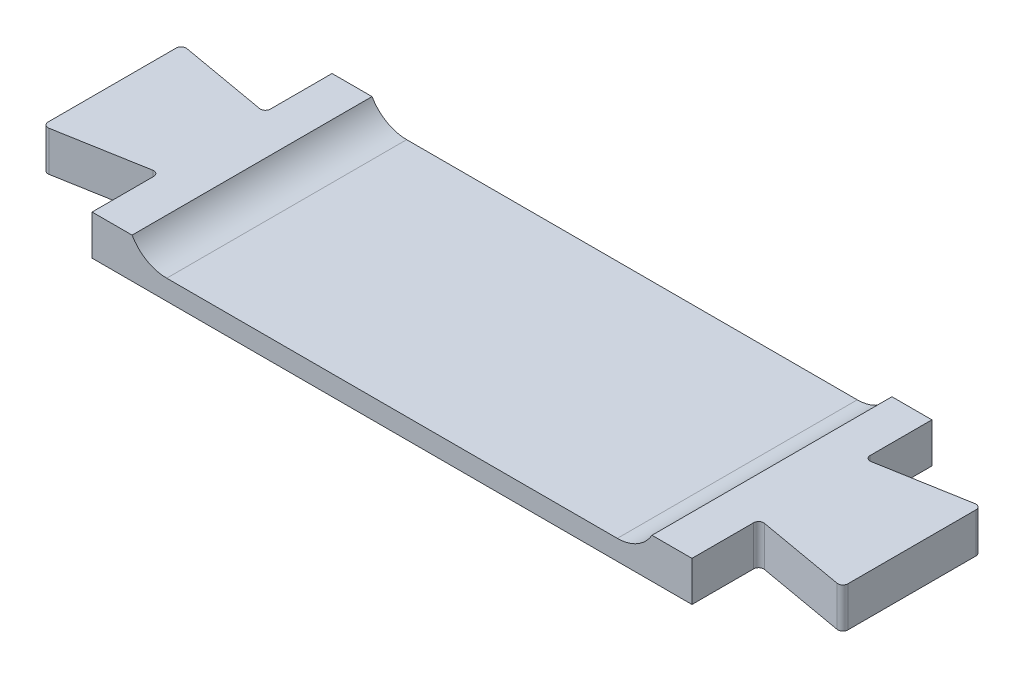
ISO-10303-21;
HEADER;
FILE_DESCRIPTION(('STEP AP214'),'2;1');
FILE_NAME('part.step','',(''),(''),'','','');
FILE_SCHEMA(('AUTOMOTIVE_DESIGN { 1 0 10303 214 1 1 1 1 }'));
ENDSEC;
DATA;
#1=APPLICATION_CONTEXT('core data for automotive mechanical design processes');
#2=APPLICATION_PROTOCOL_DEFINITION('international standard','automotive_design',2000,#1);
#3=PRODUCT_CONTEXT('',#1,'mechanical');
#4=PRODUCT('Part','Part','',(#3));
#5=PRODUCT_RELATED_PRODUCT_CATEGORY('part','',(#4));
#6=PRODUCT_DEFINITION_FORMATION('','',#4);
#7=PRODUCT_DEFINITION_CONTEXT('part definition',#1,'design');
#8=PRODUCT_DEFINITION('design','',#6,#7);
#9=PRODUCT_DEFINITION_SHAPE('','',#8);
#10=(LENGTH_UNIT() NAMED_UNIT(*) SI_UNIT(.MILLI.,.METRE.));
#11=(NAMED_UNIT(*) PLANE_ANGLE_UNIT() SI_UNIT($,.RADIAN.));
#12=(NAMED_UNIT(*) SI_UNIT($,.STERADIAN.) SOLID_ANGLE_UNIT());
#13=UNCERTAINTY_MEASURE_WITH_UNIT(LENGTH_MEASURE(1.E-05),#10,'distance_accuracy_value','');
#14=(GEOMETRIC_REPRESENTATION_CONTEXT(3) GLOBAL_UNCERTAINTY_ASSIGNED_CONTEXT((#13)) GLOBAL_UNIT_ASSIGNED_CONTEXT((#10,
#11,#12)) REPRESENTATION_CONTEXT('',''));
#15=CARTESIAN_POINT('',(0.,0.,0.));
#16=DIRECTION('',(0.,0.,1.));
#17=DIRECTION('',(1.,0.,0.));
#18=AXIS2_PLACEMENT_3D('',#15,#16,#17);
#19=CARTESIAN_POINT('',(0.,2.,0.));
#20=DIRECTION('',(0.,-1.,0.));
#21=DIRECTION('',(0.,0.,-1.));
#22=AXIS2_PLACEMENT_3D('',#19,#20,#21);
#23=PLANE('',#22);
#24=DIRECTION('',(1.,0.,0.));
#25=VECTOR('',#24,1.);
#26=CARTESIAN_POINT('',(-15.,2.,6.));
#27=LINE('',#26,#25);
#28=CARTESIAN_POINT('',(-15.,2.,6.));
#29=VERTEX_POINT('',#28);
#30=CARTESIAN_POINT('',(-13.,2.,6.));
#31=VERTEX_POINT('',#30);
#32=EDGE_CURVE('E216',#29,#31,#27,.T.);
#33=ORIENTED_EDGE('',*,*,#32,.T.);
#34=DIRECTION('',(0.,0.,1.));
#35=VECTOR('',#34,1.);
#36=CARTESIAN_POINT('',(-13.,2.,-6.));
#37=LINE('',#36,#35);
#38=CARTESIAN_POINT('',(-13.,2.,-6.));
#39=VERTEX_POINT('',#38);
#40=EDGE_CURVE('E226',#39,#31,#37,.T.);
#41=ORIENTED_EDGE('',*,*,#40,.F.);
#42=DIRECTION('',(-1.,0.,0.));
#43=VECTOR('',#42,1.);
#44=CARTESIAN_POINT('',(-15.,2.,-6.));
#45=LINE('',#44,#43);
#46=CARTESIAN_POINT('',(-15.,2.,-6.));
#47=VERTEX_POINT('',#46);
#48=EDGE_CURVE('E245',#39,#47,#45,.T.);
#49=ORIENTED_EDGE('',*,*,#48,.T.);
#50=DIRECTION('',(0.,0.,1.));
#51=VECTOR('',#50,1.);
#52=CARTESIAN_POINT('',(-15.,2.,-2.61836509645765));
#53=LINE('',#52,#51);
#54=CARTESIAN_POINT('',(-15.,2.,-2.91630349460621));
#55=VERTEX_POINT('',#54);
#56=EDGE_CURVE('E251',#47,#55,#53,.T.);
#57=ORIENTED_EDGE('',*,*,#56,.T.);
#58=CARTESIAN_POINT('',(-15.25,2.,-2.91630349460621));
#59=DIRECTION('',(0.,-1.,0.));
#60=DIRECTION('',(0.,0.,-1.));
#61=AXIS2_PLACEMENT_3D('',#58,#59,#60);
#62=CIRCLE('',#61,0.25);
#63=CARTESIAN_POINT('',(-15.2934120444167,2.,-2.67010155635316));
#64=VERTEX_POINT('',#63);
#65=EDGE_CURVE('E395',#55,#64,#62,.T.);
#66=ORIENTED_EDGE('',*,*,#65,.T.);
#67=DIRECTION('',(-0.984807753012207,0.,-0.173648177666934));
#68=VECTOR('',#67,1.);
#69=CARTESIAN_POINT('',(-15.,2.,-2.61836509645765));
#70=LINE('',#69,#68);
#71=CARTESIAN_POINT('',(-19.7065879555833,2.,-3.4482635401045));
#72=VERTEX_POINT('',#71);
#73=EDGE_CURVE('E254',#64,#72,#70,.T.);
#74=ORIENTED_EDGE('',*,*,#73,.T.);
#75=CARTESIAN_POINT('',(-19.75,2.,-3.20206160185145));
#76=DIRECTION('',(0.,-1.,0.));
#77=DIRECTION('',(0.,0.,-1.));
#78=AXIS2_PLACEMENT_3D('',#75,#76,#77);
#79=CIRCLE('',#78,0.25);
#80=CARTESIAN_POINT('',(-20.,2.,-3.20206160185145));
#81=VERTEX_POINT('',#80);
#82=EDGE_CURVE('E354',#72,#81,#79,.F.);
#83=ORIENTED_EDGE('',*,*,#82,.T.);
#84=DIRECTION('',(0.,0.,1.));
#85=VECTOR('',#84,1.);
#86=CARTESIAN_POINT('',(-20.,2.,-3.5));
#87=LINE('',#86,#85);
#88=CARTESIAN_POINT('',(-20.,2.,3.20206160185145));
#89=VERTEX_POINT('',#88);
#90=EDGE_CURVE('E257',#81,#89,#87,.T.);
#91=ORIENTED_EDGE('',*,*,#90,.T.);
#92=CARTESIAN_POINT('',(-19.75,2.,3.20206160185145));
#93=DIRECTION('',(0.,-1.,0.));
#94=DIRECTION('',(0.,0.,-1.));
#95=AXIS2_PLACEMENT_3D('',#92,#93,#94);
#96=CIRCLE('',#95,0.25);
#97=CARTESIAN_POINT('',(-19.7065879555833,2.,3.4482635401045));
#98=VERTEX_POINT('',#97);
#99=EDGE_CURVE('E356',#89,#98,#96,.F.);
#100=ORIENTED_EDGE('',*,*,#99,.T.);
#101=DIRECTION('',(0.984807753012207,0.,-0.173648177666935));
#102=VECTOR('',#101,1.);
#103=CARTESIAN_POINT('',(-15.,2.,2.61836509645765));
#104=LINE('',#103,#102);
#105=CARTESIAN_POINT('',(-15.2934120444167,2.,2.67010155635316));
#106=VERTEX_POINT('',#105);
#107=EDGE_CURVE('E260',#98,#106,#104,.T.);
#108=ORIENTED_EDGE('',*,*,#107,.T.);
#109=CARTESIAN_POINT('',(-15.25,2.,2.91630349460621));
#110=DIRECTION('',(0.,-1.,0.));
#111=DIRECTION('',(0.,0.,-1.));
#112=AXIS2_PLACEMENT_3D('',#109,#110,#111);
#113=CIRCLE('',#112,0.25);
#114=CARTESIAN_POINT('',(-15.,2.,2.91630349460621));
#115=VERTEX_POINT('',#114);
#116=EDGE_CURVE('E391',#106,#115,#113,.T.);
#117=ORIENTED_EDGE('',*,*,#116,.T.);
#118=DIRECTION('',(0.,0.,1.));
#119=VECTOR('',#118,1.);
#120=CARTESIAN_POINT('',(-15.,2.,6.));
#121=LINE('',#120,#119);
#122=EDGE_CURVE('E228',#115,#29,#121,.T.);
#123=ORIENTED_EDGE('',*,*,#122,.T.);
#124=EDGE_LOOP('',(#33,#41,#49,#57,#66,#74,#83,#91,#100,#108,#117,#123));
#125=FACE_BOUND('',#124,.T.);
#126=ADVANCED_FACE('F40',(#125),#23,.F.);
#127=CARTESIAN_POINT('',(15.,2.,-2.61836509645766));
#128=DIRECTION('',(-1.,0.,0.));
#129=DIRECTION('',(0.,0.,1.));
#130=AXIS2_PLACEMENT_3D('',#127,#128,#129);
#131=PLANE('',#130);
#132=DIRECTION('',(0.,0.,-1.));
#133=VECTOR('',#132,1.);
#134=CARTESIAN_POINT('',(15.,2.,-2.61836509645766));
#135=LINE('',#134,#133);
#136=CARTESIAN_POINT('',(15.,2.,-2.91630349460621));
#137=VERTEX_POINT('',#136);
#138=CARTESIAN_POINT('',(15.,2.,-6.));
#139=VERTEX_POINT('',#138);
#140=EDGE_CURVE('E242',#137,#139,#135,.T.);
#141=ORIENTED_EDGE('',*,*,#140,.F.);
#142=DIRECTION('',(0.,-1.,0.));
#143=VECTOR('',#142,1.);
#144=CARTESIAN_POINT('',(15.,0.,-2.91630349460621));
#145=LINE('',#144,#143);
#146=CARTESIAN_POINT('',(15.,0.,-2.91630349460621));
#147=VERTEX_POINT('',#146);
#148=EDGE_CURVE('E365',#137,#147,#145,.T.);
#149=ORIENTED_EDGE('',*,*,#148,.T.);
#150=DIRECTION('',(0.,0.,-1.));
#151=VECTOR('',#150,1.);
#152=CARTESIAN_POINT('',(15.,0.,-2.61836509645766));
#153=LINE('',#152,#151);
#154=CARTESIAN_POINT('',(15.,0.,-6.));
#155=VERTEX_POINT('',#154);
#156=EDGE_CURVE('E280',#147,#155,#153,.T.);
#157=ORIENTED_EDGE('',*,*,#156,.T.);
#158=DIRECTION('',(0.,-1.,0.));
#159=VECTOR('',#158,1.);
#160=CARTESIAN_POINT('',(15.,2.,-6.));
#161=LINE('',#160,#159);
#162=EDGE_CURVE('E324',#139,#155,#161,.T.);
#163=ORIENTED_EDGE('',*,*,#162,.F.);
#164=EDGE_LOOP('',(#141,#149,#157,#163));
#165=FACE_BOUND('',#164,.T.);
#166=ADVANCED_FACE('F461',(#165),#131,.F.);
#167=CARTESIAN_POINT('',(-15.,2.,-6.));
#168=DIRECTION('',(0.,0.,1.));
#169=DIRECTION('',(1.,0.,0.));
#170=AXIS2_PLACEMENT_3D('',#167,#168,#169);
#171=PLANE('',#170);
#172=ORIENTED_EDGE('',*,*,#48,.F.);
#173=CARTESIAN_POINT('',(-11.2679491924311,3.,-6.));
#174=DIRECTION('',(0.,0.,1.));
#175=DIRECTION('',(1.,0.,0.));
#176=AXIS2_PLACEMENT_3D('',#173,#174,#175);
#177=CIRCLE('',#176,2.);
#178=CARTESIAN_POINT('',(-11.2679491924311,1.,-6.));
#179=VERTEX_POINT('',#178);
#180=EDGE_CURVE('E56',#39,#179,#177,.T.);
#181=ORIENTED_EDGE('',*,*,#180,.T.);
#182=DIRECTION('',(-1.,0.,0.));
#183=VECTOR('',#182,1.);
#184=CARTESIAN_POINT('',(-13.,1.,-6.));
#185=LINE('',#184,#183);
#186=CARTESIAN_POINT('',(11.2679491924311,1.,-6.));
#187=VERTEX_POINT('',#186);
#188=EDGE_CURVE('E239',#187,#179,#185,.T.);
#189=ORIENTED_EDGE('',*,*,#188,.F.);
#190=CARTESIAN_POINT('',(11.2679491924311,3.,-6.));
#191=DIRECTION('',(0.,0.,1.));
#192=DIRECTION('',(1.,0.,0.));
#193=AXIS2_PLACEMENT_3D('',#190,#191,#192);
#194=CIRCLE('',#193,2.);
#195=CARTESIAN_POINT('',(13.,2.,-6.));
#196=VERTEX_POINT('',#195);
#197=EDGE_CURVE('E49',#187,#196,#194,.T.);
#198=ORIENTED_EDGE('',*,*,#197,.T.);
#199=EDGE_CURVE('E247',#139,#196,#45,.T.);
#200=ORIENTED_EDGE('',*,*,#199,.F.);
#201=ORIENTED_EDGE('',*,*,#162,.T.);
#202=DIRECTION('',(-1.,0.,0.));
#203=VECTOR('',#202,1.);
#204=CARTESIAN_POINT('',(-15.,0.,-6.));
#205=LINE('',#204,#203);
#206=CARTESIAN_POINT('',(-15.,0.,-6.));
#207=VERTEX_POINT('',#206);
#208=EDGE_CURVE('E282',#155,#207,#205,.T.);
#209=ORIENTED_EDGE('',*,*,#208,.T.);
#210=DIRECTION('',(0.,-1.,0.));
#211=VECTOR('',#210,1.);
#212=CARTESIAN_POINT('',(-15.,2.,-6.));
#213=LINE('',#212,#211);
#214=EDGE_CURVE('E321',#47,#207,#213,.T.);
#215=ORIENTED_EDGE('',*,*,#214,.F.);
#216=EDGE_LOOP('',(#172,#181,#189,#198,#200,#201,#209,#215));
#217=FACE_BOUND('',#216,.T.);
#218=ADVANCED_FACE('F411',(#217),#171,.F.);
#219=CARTESIAN_POINT('',(-15.,2.,-2.61836509645765));
#220=DIRECTION('',(1.,0.,0.));
#221=DIRECTION('',(0.,0.,-1.));
#222=AXIS2_PLACEMENT_3D('',#219,#220,#221);
#223=PLANE('',#222);
#224=DIRECTION('',(0.,0.,1.));
#225=VECTOR('',#224,1.);
#226=CARTESIAN_POINT('',(-15.,0.,-2.61836509645765));
#227=LINE('',#226,#225);
#228=CARTESIAN_POINT('',(-15.,0.,-2.91630349460621));
#229=VERTEX_POINT('',#228);
#230=EDGE_CURVE('E284',#207,#229,#227,.T.);
#231=ORIENTED_EDGE('',*,*,#230,.T.);
#232=DIRECTION('',(0.,-1.,0.));
#233=VECTOR('',#232,1.);
#234=CARTESIAN_POINT('',(-15.,2.,-2.91630349460621));
#235=LINE('',#234,#233);
#236=EDGE_CURVE('E363',#229,#55,#235,.F.);
#237=ORIENTED_EDGE('',*,*,#236,.T.);
#238=ORIENTED_EDGE('',*,*,#56,.F.);
#239=ORIENTED_EDGE('',*,*,#214,.T.);
#240=EDGE_LOOP('',(#231,#237,#238,#239));
#241=FACE_BOUND('',#240,.T.);
#242=ADVANCED_FACE('F469',(#241),#223,.F.);
#243=CARTESIAN_POINT('',(-15.,2.,-2.61836509645765));
#244=DIRECTION('',(-0.173648177666934,0.,0.984807753012207));
#245=DIRECTION('',(0.984807753012208,0.,0.173648177666934));
#246=AXIS2_PLACEMENT_3D('',#243,#244,#245);
#247=PLANE('',#246);
#248=DIRECTION('',(-0.984807753012207,0.,-0.173648177666934));
#249=VECTOR('',#248,1.);
#250=CARTESIAN_POINT('',(-15.,0.,-2.61836509645765));
#251=LINE('',#250,#249);
#252=CARTESIAN_POINT('',(-15.2934120444167,0.,-2.67010155635316));
#253=VERTEX_POINT('',#252);
#254=CARTESIAN_POINT('',(-19.7065879555833,0.,-3.4482635401045));
#255=VERTEX_POINT('',#254);
#256=EDGE_CURVE('E287',#253,#255,#251,.T.);
#257=ORIENTED_EDGE('',*,*,#256,.T.);
#258=DIRECTION('',(0.,-1.,0.));
#259=VECTOR('',#258,1.);
#260=CARTESIAN_POINT('',(-19.7065879555833,2.,-3.4482635401045));
#261=LINE('',#260,#259);
#262=EDGE_CURVE('E361',#255,#72,#261,.F.);
#263=ORIENTED_EDGE('',*,*,#262,.T.);
#264=ORIENTED_EDGE('',*,*,#73,.F.);
#265=DIRECTION('',(0.,-1.,0.));
#266=VECTOR('',#265,1.);
#267=CARTESIAN_POINT('',(-15.2934120444167,0.,-2.67010155635316));
#268=LINE('',#267,#266);
#269=EDGE_CURVE('E358',#64,#253,#268,.T.);
#270=ORIENTED_EDGE('',*,*,#269,.T.);
#271=EDGE_LOOP('',(#257,#263,#264,#270));
#272=FACE_BOUND('',#271,.T.);
#273=ADVANCED_FACE('F480',(#272),#247,.F.);
#274=CARTESIAN_POINT('',(-20.,2.,-3.5));
#275=DIRECTION('',(1.,0.,0.));
#276=DIRECTION('',(0.,0.,-1.));
#277=AXIS2_PLACEMENT_3D('',#274,#275,#276);
#278=PLANE('',#277);
#279=DIRECTION('',(0.,0.,1.));
#280=VECTOR('',#279,1.);
#281=CARTESIAN_POINT('',(-20.,0.,-3.5));
#282=LINE('',#281,#280);
#283=CARTESIAN_POINT('',(-20.,0.,-3.20206160185145));
#284=VERTEX_POINT('',#283);
#285=CARTESIAN_POINT('',(-20.,0.,3.20206160185145));
#286=VERTEX_POINT('',#285);
#287=EDGE_CURVE('E290',#284,#286,#282,.T.);
#288=ORIENTED_EDGE('',*,*,#287,.T.);
#289=DIRECTION('',(0.,-1.,0.));
#290=VECTOR('',#289,1.);
#291=CARTESIAN_POINT('',(-20.,2.,3.20206160185145));
#292=LINE('',#291,#290);
#293=EDGE_CURVE('E348',#286,#89,#292,.F.);
#294=ORIENTED_EDGE('',*,*,#293,.T.);
#295=ORIENTED_EDGE('',*,*,#90,.F.);
#296=DIRECTION('',(0.,-1.,0.));
#297=VECTOR('',#296,1.);
#298=CARTESIAN_POINT('',(-20.,2.,-3.20206160185145));
#299=LINE('',#298,#297);
#300=EDGE_CURVE('E345',#81,#284,#299,.T.);
#301=ORIENTED_EDGE('',*,*,#300,.T.);
#302=EDGE_LOOP('',(#288,#294,#295,#301));
#303=FACE_BOUND('',#302,.T.);
#304=ADVANCED_FACE('F489',(#303),#278,.F.);
#305=CARTESIAN_POINT('',(-15.,2.,2.61836509645765));
#306=DIRECTION('',(-0.173648177666935,0.,-0.984807753012207));
#307=DIRECTION('',(-0.984807753012207,0.,0.173648177666935));
#308=AXIS2_PLACEMENT_3D('',#305,#306,#307);
#309=PLANE('',#308);
#310=DIRECTION('',(0.984807753012207,0.,-0.173648177666935));
#311=VECTOR('',#310,1.);
#312=CARTESIAN_POINT('',(-15.,0.,2.61836509645765));
#313=LINE('',#312,#311);
#314=CARTESIAN_POINT('',(-19.7065879555833,0.,3.4482635401045));
#315=VERTEX_POINT('',#314);
#316=CARTESIAN_POINT('',(-15.2934120444167,0.,2.67010155635316));
#317=VERTEX_POINT('',#316);
#318=EDGE_CURVE('E293',#315,#317,#313,.T.);
#319=ORIENTED_EDGE('',*,*,#318,.T.);
#320=DIRECTION('',(0.,-1.,0.));
#321=VECTOR('',#320,1.);
#322=CARTESIAN_POINT('',(-15.2934120444167,2.,2.67010155635316));
#323=LINE('',#322,#321);
#324=EDGE_CURVE('E334',#317,#106,#323,.F.);
#325=ORIENTED_EDGE('',*,*,#324,.T.);
#326=ORIENTED_EDGE('',*,*,#107,.F.);
#327=DIRECTION('',(0.,-1.,0.));
#328=VECTOR('',#327,1.);
#329=CARTESIAN_POINT('',(-19.7065879555833,2.,3.4482635401045));
#330=LINE('',#329,#328);
#331=EDGE_CURVE('E331',#98,#315,#330,.T.);
#332=ORIENTED_EDGE('',*,*,#331,.T.);
#333=EDGE_LOOP('',(#319,#325,#326,#332));
#334=FACE_BOUND('',#333,.T.);
#335=ADVANCED_FACE('F497',(#334),#309,.F.);
#336=CARTESIAN_POINT('',(-15.,2.,6.));
#337=DIRECTION('',(1.,0.,0.));
#338=DIRECTION('',(0.,0.,-1.));
#339=AXIS2_PLACEMENT_3D('',#336,#337,#338);
#340=PLANE('',#339);
#341=ORIENTED_EDGE('',*,*,#122,.F.);
#342=DIRECTION('',(0.,-1.,0.));
#343=VECTOR('',#342,1.);
#344=CARTESIAN_POINT('',(-15.,0.,2.91630349460621));
#345=LINE('',#344,#343);
#346=CARTESIAN_POINT('',(-15.,0.,2.91630349460621));
#347=VERTEX_POINT('',#346);
#348=EDGE_CURVE('E328',#115,#347,#345,.T.);
#349=ORIENTED_EDGE('',*,*,#348,.T.);
#350=DIRECTION('',(0.,0.,1.));
#351=VECTOR('',#350,1.);
#352=CARTESIAN_POINT('',(-15.,0.,6.));
#353=LINE('',#352,#351);
#354=CARTESIAN_POINT('',(-15.,0.,6.));
#355=VERTEX_POINT('',#354);
#356=EDGE_CURVE('E296',#347,#355,#353,.T.);
#357=ORIENTED_EDGE('',*,*,#356,.T.);
#358=DIRECTION('',(0.,-1.,0.));
#359=VECTOR('',#358,1.);
#360=CARTESIAN_POINT('',(-15.,2.,6.));
#361=LINE('',#360,#359);
#362=EDGE_CURVE('E319',#29,#355,#361,.T.);
#363=ORIENTED_EDGE('',*,*,#362,.F.);
#364=EDGE_LOOP('',(#341,#349,#357,#363));
#365=FACE_BOUND('',#364,.T.);
#366=ADVANCED_FACE('F505',(#365),#340,.F.);
#367=CARTESIAN_POINT('',(-15.,2.,6.));
#368=DIRECTION('',(0.,0.,-1.));
#369=DIRECTION('',(-1.,0.,0.));
#370=AXIS2_PLACEMENT_3D('',#367,#368,#369);
#371=PLANE('',#370);
#372=DIRECTION('',(1.,0.,0.));
#373=VECTOR('',#372,1.);
#374=CARTESIAN_POINT('',(-13.,1.,6.));
#375=LINE('',#374,#373);
#376=CARTESIAN_POINT('',(-11.2679491924311,1.,6.));
#377=VERTEX_POINT('',#376);
#378=CARTESIAN_POINT('',(11.2679491924311,1.,6.));
#379=VERTEX_POINT('',#378);
#380=EDGE_CURVE('E218',#377,#379,#375,.T.);
#381=ORIENTED_EDGE('',*,*,#380,.F.);
#382=CARTESIAN_POINT('',(-11.2679491924311,3.,6.));
#383=DIRECTION('',(0.,0.,-1.));
#384=DIRECTION('',(-1.,0.,0.));
#385=AXIS2_PLACEMENT_3D('',#382,#383,#384);
#386=CIRCLE('',#385,2.);
#387=EDGE_CURVE('E212',#377,#31,#386,.T.);
#388=ORIENTED_EDGE('',*,*,#387,.T.);
#389=ORIENTED_EDGE('',*,*,#32,.F.);
#390=ORIENTED_EDGE('',*,*,#362,.T.);
#391=DIRECTION('',(1.,0.,0.));
#392=VECTOR('',#391,1.);
#393=CARTESIAN_POINT('',(-15.,0.,6.));
#394=LINE('',#393,#392);
#395=CARTESIAN_POINT('',(15.,0.,6.));
#396=VERTEX_POINT('',#395);
#397=EDGE_CURVE('E298',#355,#396,#394,.T.);
#398=ORIENTED_EDGE('',*,*,#397,.T.);
#399=DIRECTION('',(0.,-1.,0.));
#400=VECTOR('',#399,1.);
#401=CARTESIAN_POINT('',(15.,2.,6.));
#402=LINE('',#401,#400);
#403=CARTESIAN_POINT('',(15.,2.,6.));
#404=VERTEX_POINT('',#403);
#405=EDGE_CURVE('E279',#404,#396,#402,.T.);
#406=ORIENTED_EDGE('',*,*,#405,.F.);
#407=CARTESIAN_POINT('',(13.,2.,6.));
#408=VERTEX_POINT('',#407);
#409=EDGE_CURVE('E231',#408,#404,#27,.T.);
#410=ORIENTED_EDGE('',*,*,#409,.F.);
#411=CARTESIAN_POINT('',(11.2679491924311,3.,6.));
#412=DIRECTION('',(0.,0.,-1.));
#413=DIRECTION('',(-1.,0.,0.));
#414=AXIS2_PLACEMENT_3D('',#411,#412,#413);
#415=CIRCLE('',#414,2.);
#416=EDGE_CURVE('E11',#408,#379,#415,.T.);
#417=ORIENTED_EDGE('',*,*,#416,.T.);
#418=EDGE_LOOP('',(#381,#388,#389,#390,#398,#406,#410,#417));
#419=FACE_BOUND('',#418,.T.);
#420=ADVANCED_FACE('F214',(#419),#371,.F.);
#421=CARTESIAN_POINT('',(15.,2.,6.));
#422=DIRECTION('',(-1.,0.,0.));
#423=DIRECTION('',(0.,0.,1.));
#424=AXIS2_PLACEMENT_3D('',#421,#422,#423);
#425=PLANE('',#424);
#426=DIRECTION('',(0.,0.,-1.));
#427=VECTOR('',#426,1.);
#428=CARTESIAN_POINT('',(15.,0.,6.));
#429=LINE('',#428,#427);
#430=CARTESIAN_POINT('',(15.,0.,2.91630349460621));
#431=VERTEX_POINT('',#430);
#432=EDGE_CURVE('E301',#396,#431,#429,.T.);
#433=ORIENTED_EDGE('',*,*,#432,.T.);
#434=DIRECTION('',(0.,-1.,0.));
#435=VECTOR('',#434,1.);
#436=CARTESIAN_POINT('',(15.,2.,2.91630349460621));
#437=LINE('',#436,#435);
#438=CARTESIAN_POINT('',(15.,2.,2.91630349460621));
#439=VERTEX_POINT('',#438);
#440=EDGE_CURVE('E386',#431,#439,#437,.F.);
#441=ORIENTED_EDGE('',*,*,#440,.T.);
#442=DIRECTION('',(0.,0.,-1.));
#443=VECTOR('',#442,1.);
#444=CARTESIAN_POINT('',(15.,2.,6.));
#445=LINE('',#444,#443);
#446=EDGE_CURVE('E230',#404,#439,#445,.T.);
#447=ORIENTED_EDGE('',*,*,#446,.F.);
#448=ORIENTED_EDGE('',*,*,#405,.T.);
#449=EDGE_LOOP('',(#433,#441,#447,#448));
#450=FACE_BOUND('',#449,.T.);
#451=ADVANCED_FACE('F428',(#450),#425,.F.);
#452=CARTESIAN_POINT('',(15.,2.,2.61836509645765));
#453=DIRECTION('',(0.173648177666935,0.,-0.984807753012207));
#454=DIRECTION('',(-0.984807753012207,0.,-0.173648177666935));
#455=AXIS2_PLACEMENT_3D('',#452,#453,#454);
#456=PLANE('',#455);
#457=DIRECTION('',(0.984807753012207,0.,0.173648177666935));
#458=VECTOR('',#457,1.);
#459=CARTESIAN_POINT('',(15.,0.,2.61836509645765));
#460=LINE('',#459,#458);
#461=CARTESIAN_POINT('',(15.2934120444167,0.,2.67010155635316));
#462=VERTEX_POINT('',#461);
#463=CARTESIAN_POINT('',(19.7065879555833,0.,3.4482635401045));
#464=VERTEX_POINT('',#463);
#465=EDGE_CURVE('E305',#462,#464,#460,.T.);
#466=ORIENTED_EDGE('',*,*,#465,.T.);
#467=DIRECTION('',(0.,-1.,0.));
#468=VECTOR('',#467,1.);
#469=CARTESIAN_POINT('',(19.7065879555833,2.,3.4482635401045));
#470=LINE('',#469,#468);
#471=CARTESIAN_POINT('',(19.7065879555833,2.,3.4482635401045));
#472=VERTEX_POINT('',#471);
#473=EDGE_CURVE('E383',#464,#472,#470,.F.);
#474=ORIENTED_EDGE('',*,*,#473,.T.);
#475=DIRECTION('',(0.984807753012207,0.,0.173648177666935));
#476=VECTOR('',#475,1.);
#477=CARTESIAN_POINT('',(15.,2.,2.61836509645765));
#478=LINE('',#477,#476);
#479=CARTESIAN_POINT('',(15.2934120444167,2.,2.67010155635316));
#480=VERTEX_POINT('',#479);
#481=EDGE_CURVE('E267',#480,#472,#478,.T.);
#482=ORIENTED_EDGE('',*,*,#481,.F.);
#483=DIRECTION('',(0.,-1.,0.));
#484=VECTOR('',#483,1.);
#485=CARTESIAN_POINT('',(15.2934120444167,0.,2.67010155635316));
#486=LINE('',#485,#484);
#487=EDGE_CURVE('E379',#480,#462,#486,.T.);
#488=ORIENTED_EDGE('',*,*,#487,.T.);
#489=EDGE_LOOP('',(#466,#474,#482,#488));
#490=FACE_BOUND('',#489,.T.);
#491=ADVANCED_FACE('F436',(#490),#456,.F.);
#492=CARTESIAN_POINT('',(20.,2.,-3.50000000000001));
#493=DIRECTION('',(-1.,0.,0.));
#494=DIRECTION('',(0.,0.,1.));
#495=AXIS2_PLACEMENT_3D('',#492,#493,#494);
#496=PLANE('',#495);
#497=DIRECTION('',(0.,0.,-1.));
#498=VECTOR('',#497,1.);
#499=CARTESIAN_POINT('',(20.,0.,-3.50000000000001));
#500=LINE('',#499,#498);
#501=CARTESIAN_POINT('',(20.,0.,3.20206160185145));
#502=VERTEX_POINT('',#501);
#503=CARTESIAN_POINT('',(20.,0.,-3.20206160185145));
#504=VERTEX_POINT('',#503);
#505=EDGE_CURVE('E309',#502,#504,#500,.T.);
#506=ORIENTED_EDGE('',*,*,#505,.T.);
#507=DIRECTION('',(0.,-1.,0.));
#508=VECTOR('',#507,1.);
#509=CARTESIAN_POINT('',(20.,2.,-3.20206160185145));
#510=LINE('',#509,#508);
#511=CARTESIAN_POINT('',(20.,2.,-3.20206160185145));
#512=VERTEX_POINT('',#511);
#513=EDGE_CURVE('E377',#504,#512,#510,.F.);
#514=ORIENTED_EDGE('',*,*,#513,.T.);
#515=DIRECTION('',(0.,0.,-1.));
#516=VECTOR('',#515,1.);
#517=CARTESIAN_POINT('',(20.,2.,-3.50000000000001));
#518=LINE('',#517,#516);
#519=CARTESIAN_POINT('',(20.,2.,3.20206160185145));
#520=VERTEX_POINT('',#519);
#521=EDGE_CURVE('E271',#520,#512,#518,.T.);
#522=ORIENTED_EDGE('',*,*,#521,.F.);
#523=DIRECTION('',(0.,-1.,0.));
#524=VECTOR('',#523,1.);
#525=CARTESIAN_POINT('',(20.,2.,3.20206160185145));
#526=LINE('',#525,#524);
#527=EDGE_CURVE('E373',#520,#502,#526,.T.);
#528=ORIENTED_EDGE('',*,*,#527,.T.);
#529=EDGE_LOOP('',(#506,#514,#522,#528));
#530=FACE_BOUND('',#529,.T.);
#531=ADVANCED_FACE('F445',(#530),#496,.F.);
#532=CARTESIAN_POINT('',(15.,2.,-2.61836509645766));
#533=DIRECTION('',(0.173648177666935,0.,0.984807753012207));
#534=DIRECTION('',(0.984807753012207,0.,-0.173648177666935));
#535=AXIS2_PLACEMENT_3D('',#532,#533,#534);
#536=PLANE('',#535);
#537=DIRECTION('',(-0.984807753012207,0.,0.173648177666935));
#538=VECTOR('',#537,1.);
#539=CARTESIAN_POINT('',(15.,0.,-2.61836509645766));
#540=LINE('',#539,#538);
#541=CARTESIAN_POINT('',(19.7065879555833,0.,-3.44826354010451));
#542=VERTEX_POINT('',#541);
#543=CARTESIAN_POINT('',(15.2934120444167,0.,-2.67010155635316));
#544=VERTEX_POINT('',#543);
#545=EDGE_CURVE('E246',#542,#544,#540,.T.);
#546=ORIENTED_EDGE('',*,*,#545,.T.);
#547=DIRECTION('',(0.,-1.,0.));
#548=VECTOR('',#547,1.);
#549=CARTESIAN_POINT('',(15.2934120444167,2.,-2.67010155635316));
#550=LINE('',#549,#548);
#551=CARTESIAN_POINT('',(15.2934120444167,2.,-2.67010155635316));
#552=VERTEX_POINT('',#551);
#553=EDGE_CURVE('E371',#544,#552,#550,.F.);
#554=ORIENTED_EDGE('',*,*,#553,.T.);
#555=DIRECTION('',(-0.984807753012207,0.,0.173648177666935));
#556=VECTOR('',#555,1.);
#557=CARTESIAN_POINT('',(15.,2.,-2.61836509645766));
#558=LINE('',#557,#556);
#559=CARTESIAN_POINT('',(19.7065879555833,2.,-3.44826354010451));
#560=VERTEX_POINT('',#559);
#561=EDGE_CURVE('E275',#560,#552,#558,.T.);
#562=ORIENTED_EDGE('',*,*,#561,.F.);
#563=DIRECTION('',(0.,-1.,0.));
#564=VECTOR('',#563,1.);
#565=CARTESIAN_POINT('',(19.7065879555833,2.,-3.44826354010451));
#566=LINE('',#565,#564);
#567=EDGE_CURVE('E368',#560,#542,#566,.T.);
#568=ORIENTED_EDGE('',*,*,#567,.T.);
#569=EDGE_LOOP('',(#546,#554,#562,#568));
#570=FACE_BOUND('',#569,.T.);
#571=ADVANCED_FACE('F454',(#570),#536,.F.);
#572=ORIENTED_EDGE('',*,*,#199,.T.);
#573=DIRECTION('',(0.,0.,-1.));
#574=VECTOR('',#573,1.);
#575=CARTESIAN_POINT('',(13.,2.,-6.));
#576=LINE('',#575,#574);
#577=EDGE_CURVE('E234',#408,#196,#576,.T.);
#578=ORIENTED_EDGE('',*,*,#577,.F.);
#579=ORIENTED_EDGE('',*,*,#409,.T.);
#580=ORIENTED_EDGE('',*,*,#446,.T.);
#581=CARTESIAN_POINT('',(15.25,2.,2.91630349460621));
#582=DIRECTION('',(0.,-1.,0.));
#583=DIRECTION('',(0.,0.,-1.));
#584=AXIS2_PLACEMENT_3D('',#581,#582,#583);
#585=CIRCLE('',#584,0.25);
#586=EDGE_CURVE('E404',#439,#480,#585,.T.);
#587=ORIENTED_EDGE('',*,*,#586,.T.);
#588=ORIENTED_EDGE('',*,*,#481,.T.);
#589=CARTESIAN_POINT('',(19.75,2.,3.20206160185145));
#590=DIRECTION('',(0.,-1.,0.));
#591=DIRECTION('',(0.,0.,-1.));
#592=AXIS2_PLACEMENT_3D('',#589,#590,#591);
#593=CIRCLE('',#592,0.25);
#594=EDGE_CURVE('E350',#472,#520,#593,.F.);
#595=ORIENTED_EDGE('',*,*,#594,.T.);
#596=ORIENTED_EDGE('',*,*,#521,.T.);
#597=CARTESIAN_POINT('',(19.75,2.,-3.20206160185145));
#598=DIRECTION('',(0.,-1.,0.));
#599=DIRECTION('',(0.,0.,-1.));
#600=AXIS2_PLACEMENT_3D('',#597,#598,#599);
#601=CIRCLE('',#600,0.25);
#602=EDGE_CURVE('E352',#512,#560,#601,.F.);
#603=ORIENTED_EDGE('',*,*,#602,.T.);
#604=ORIENTED_EDGE('',*,*,#561,.T.);
#605=CARTESIAN_POINT('',(15.25,2.,-2.91630349460621));
#606=DIRECTION('',(0.,-1.,0.));
#607=DIRECTION('',(0.,0.,-1.));
#608=AXIS2_PLACEMENT_3D('',#605,#606,#607);
#609=CIRCLE('',#608,0.25);
#610=EDGE_CURVE('E399',#552,#137,#609,.T.);
#611=ORIENTED_EDGE('',*,*,#610,.T.);
#612=ORIENTED_EDGE('',*,*,#140,.T.);
#613=EDGE_LOOP('',(#572,#578,#579,#580,#587,#588,#595,#596,#603,#604,#611,#612));
#614=FACE_BOUND('',#613,.T.);
#615=ADVANCED_FACE('F414',(#614),#23,.F.);
#616=CARTESIAN_POINT('',(0.,0.,0.));
#617=DIRECTION('',(0.,-1.,0.));
#618=DIRECTION('',(0.,0.,-1.));
#619=AXIS2_PLACEMENT_3D('',#616,#617,#618);
#620=PLANE('',#619);
#621=ORIENTED_EDGE('',*,*,#318,.F.);
#622=CARTESIAN_POINT('',(-19.75,0.,3.20206160185145));
#623=DIRECTION('',(0.,-1.,0.));
#624=DIRECTION('',(0.,0.,-1.));
#625=AXIS2_PLACEMENT_3D('',#622,#623,#624);
#626=CIRCLE('',#625,0.25);
#627=EDGE_CURVE('E343',#315,#286,#626,.T.);
#628=ORIENTED_EDGE('',*,*,#627,.T.);
#629=ORIENTED_EDGE('',*,*,#287,.F.);
#630=CARTESIAN_POINT('',(-19.75,0.,-3.20206160185145));
#631=DIRECTION('',(0.,-1.,0.));
#632=DIRECTION('',(0.,0.,-1.));
#633=AXIS2_PLACEMENT_3D('',#630,#631,#632);
#634=CIRCLE('',#633,0.25);
#635=EDGE_CURVE('E341',#284,#255,#634,.T.);
#636=ORIENTED_EDGE('',*,*,#635,.T.);
#637=ORIENTED_EDGE('',*,*,#256,.F.);
#638=CARTESIAN_POINT('',(-15.25,0.,-2.91630349460621));
#639=DIRECTION('',(0.,-1.,0.));
#640=DIRECTION('',(0.,0.,-1.));
#641=AXIS2_PLACEMENT_3D('',#638,#639,#640);
#642=CIRCLE('',#641,0.25);
#643=EDGE_CURVE('E393',#253,#229,#642,.F.);
#644=ORIENTED_EDGE('',*,*,#643,.T.);
#645=ORIENTED_EDGE('',*,*,#230,.F.);
#646=ORIENTED_EDGE('',*,*,#208,.F.);
#647=ORIENTED_EDGE('',*,*,#156,.F.);
#648=CARTESIAN_POINT('',(15.25,0.,-2.91630349460621));
#649=DIRECTION('',(0.,-1.,0.));
#650=DIRECTION('',(0.,0.,-1.));
#651=AXIS2_PLACEMENT_3D('',#648,#649,#650);
#652=CIRCLE('',#651,0.25);
#653=EDGE_CURVE('E397',#147,#544,#652,.F.);
#654=ORIENTED_EDGE('',*,*,#653,.T.);
#655=ORIENTED_EDGE('',*,*,#545,.F.);
#656=CARTESIAN_POINT('',(19.75,0.,-3.20206160185145));
#657=DIRECTION('',(0.,-1.,0.));
#658=DIRECTION('',(0.,0.,-1.));
#659=AXIS2_PLACEMENT_3D('',#656,#657,#658);
#660=CIRCLE('',#659,0.25);
#661=EDGE_CURVE('E339',#542,#504,#660,.T.);
#662=ORIENTED_EDGE('',*,*,#661,.T.);
#663=ORIENTED_EDGE('',*,*,#505,.F.);
#664=CARTESIAN_POINT('',(19.75,0.,3.20206160185145));
#665=DIRECTION('',(0.,-1.,0.));
#666=DIRECTION('',(0.,0.,-1.));
#667=AXIS2_PLACEMENT_3D('',#664,#665,#666);
#668=CIRCLE('',#667,0.25);
#669=EDGE_CURVE('E336',#502,#464,#668,.T.);
#670=ORIENTED_EDGE('',*,*,#669,.T.);
#671=ORIENTED_EDGE('',*,*,#465,.F.);
#672=CARTESIAN_POINT('',(15.25,0.,2.91630349460621));
#673=DIRECTION('',(0.,-1.,0.));
#674=DIRECTION('',(0.,0.,-1.));
#675=AXIS2_PLACEMENT_3D('',#672,#673,#674);
#676=CIRCLE('',#675,0.25);
#677=EDGE_CURVE('E401',#462,#431,#676,.F.);
#678=ORIENTED_EDGE('',*,*,#677,.T.);
#679=ORIENTED_EDGE('',*,*,#432,.F.);
#680=ORIENTED_EDGE('',*,*,#397,.F.);
#681=ORIENTED_EDGE('',*,*,#356,.F.);
#682=CARTESIAN_POINT('',(-15.25,0.,2.91630349460621));
#683=DIRECTION('',(0.,-1.,0.));
#684=DIRECTION('',(0.,0.,-1.));
#685=AXIS2_PLACEMENT_3D('',#682,#683,#684);
#686=CIRCLE('',#685,0.25);
#687=EDGE_CURVE('E389',#347,#317,#686,.F.);
#688=ORIENTED_EDGE('',*,*,#687,.T.);
#689=EDGE_LOOP('',(#621,#628,#629,#636,#637,#644,#645,#646,#647,#654,#655,#662,#663,#670,#671,
#678,#679,#680,#681,#688));
#690=FACE_BOUND('',#689,.T.);
#691=ADVANCED_FACE('F472',(#690),#620,.T.);
#692=CARTESIAN_POINT('',(-15.25,2.,2.91630349460621));
#693=DIRECTION('',(0.,1.,0.));
#694=DIRECTION('',(0.,0.,1.));
#695=AXIS2_PLACEMENT_3D('',#692,#693,#694);
#696=CYLINDRICAL_SURFACE('',#695,0.25);
#697=ORIENTED_EDGE('',*,*,#116,.F.);
#698=ORIENTED_EDGE('',*,*,#324,.F.);
#699=ORIENTED_EDGE('',*,*,#687,.F.);
#700=ORIENTED_EDGE('',*,*,#348,.F.);
#701=EDGE_LOOP('',(#697,#698,#699,#700));
#702=FACE_BOUND('',#701,.T.);
#703=ADVANCED_FACE('F502',(#702),#696,.F.);
#704=CARTESIAN_POINT('',(-19.75,2.,3.20206160185145));
#705=DIRECTION('',(0.,-1.,0.));
#706=DIRECTION('',(0.,0.,-1.));
#707=AXIS2_PLACEMENT_3D('',#704,#705,#706);
#708=CYLINDRICAL_SURFACE('',#707,0.25);
#709=ORIENTED_EDGE('',*,*,#99,.F.);
#710=ORIENTED_EDGE('',*,*,#293,.F.);
#711=ORIENTED_EDGE('',*,*,#627,.F.);
#712=ORIENTED_EDGE('',*,*,#331,.F.);
#713=EDGE_LOOP('',(#709,#710,#711,#712));
#714=FACE_BOUND('',#713,.T.);
#715=ADVANCED_FACE('F494',(#714),#708,.T.);
#716=CARTESIAN_POINT('',(-19.75,2.,-3.20206160185145));
#717=DIRECTION('',(0.,-1.,0.));
#718=DIRECTION('',(0.,0.,-1.));
#719=AXIS2_PLACEMENT_3D('',#716,#717,#718);
#720=CYLINDRICAL_SURFACE('',#719,0.25);
#721=ORIENTED_EDGE('',*,*,#82,.F.);
#722=ORIENTED_EDGE('',*,*,#262,.F.);
#723=ORIENTED_EDGE('',*,*,#635,.F.);
#724=ORIENTED_EDGE('',*,*,#300,.F.);
#725=EDGE_LOOP('',(#721,#722,#723,#724));
#726=FACE_BOUND('',#725,.T.);
#727=ADVANCED_FACE('F486',(#726),#720,.T.);
#728=CARTESIAN_POINT('',(-15.25,2.,-2.91630349460621));
#729=DIRECTION('',(0.,1.,0.));
#730=DIRECTION('',(0.,0.,1.));
#731=AXIS2_PLACEMENT_3D('',#728,#729,#730);
#732=CYLINDRICAL_SURFACE('',#731,0.25);
#733=ORIENTED_EDGE('',*,*,#65,.F.);
#734=ORIENTED_EDGE('',*,*,#236,.F.);
#735=ORIENTED_EDGE('',*,*,#643,.F.);
#736=ORIENTED_EDGE('',*,*,#269,.F.);
#737=EDGE_LOOP('',(#733,#734,#735,#736));
#738=FACE_BOUND('',#737,.T.);
#739=ADVANCED_FACE('F477',(#738),#732,.F.);
#740=CARTESIAN_POINT('',(15.25,2.,-2.91630349460621));
#741=DIRECTION('',(0.,1.,0.));
#742=DIRECTION('',(0.,0.,1.));
#743=AXIS2_PLACEMENT_3D('',#740,#741,#742);
#744=CYLINDRICAL_SURFACE('',#743,0.25);
#745=ORIENTED_EDGE('',*,*,#610,.F.);
#746=ORIENTED_EDGE('',*,*,#553,.F.);
#747=ORIENTED_EDGE('',*,*,#653,.F.);
#748=ORIENTED_EDGE('',*,*,#148,.F.);
#749=EDGE_LOOP('',(#745,#746,#747,#748));
#750=FACE_BOUND('',#749,.T.);
#751=ADVANCED_FACE('F458',(#750),#744,.F.);
#752=CARTESIAN_POINT('',(19.75,2.,-3.20206160185145));
#753=DIRECTION('',(0.,-1.,0.));
#754=DIRECTION('',(0.,0.,-1.));
#755=AXIS2_PLACEMENT_3D('',#752,#753,#754);
#756=CYLINDRICAL_SURFACE('',#755,0.25);
#757=ORIENTED_EDGE('',*,*,#602,.F.);
#758=ORIENTED_EDGE('',*,*,#513,.F.);
#759=ORIENTED_EDGE('',*,*,#661,.F.);
#760=ORIENTED_EDGE('',*,*,#567,.F.);
#761=EDGE_LOOP('',(#757,#758,#759,#760));
#762=FACE_BOUND('',#761,.T.);
#763=ADVANCED_FACE('F449',(#762),#756,.T.);
#764=CARTESIAN_POINT('',(19.75,2.,3.20206160185145));
#765=DIRECTION('',(0.,-1.,0.));
#766=DIRECTION('',(0.,0.,-1.));
#767=AXIS2_PLACEMENT_3D('',#764,#765,#766);
#768=CYLINDRICAL_SURFACE('',#767,0.25);
#769=ORIENTED_EDGE('',*,*,#594,.F.);
#770=ORIENTED_EDGE('',*,*,#473,.F.);
#771=ORIENTED_EDGE('',*,*,#669,.F.);
#772=ORIENTED_EDGE('',*,*,#527,.F.);
#773=EDGE_LOOP('',(#769,#770,#771,#772));
#774=FACE_BOUND('',#773,.T.);
#775=ADVANCED_FACE('F440',(#774),#768,.T.);
#776=CARTESIAN_POINT('',(15.25,2.,2.91630349460621));
#777=DIRECTION('',(0.,1.,0.));
#778=DIRECTION('',(0.,0.,1.));
#779=AXIS2_PLACEMENT_3D('',#776,#777,#778);
#780=CYLINDRICAL_SURFACE('',#779,0.25);
#781=ORIENTED_EDGE('',*,*,#586,.F.);
#782=ORIENTED_EDGE('',*,*,#440,.F.);
#783=ORIENTED_EDGE('',*,*,#677,.F.);
#784=ORIENTED_EDGE('',*,*,#487,.F.);
#785=EDGE_LOOP('',(#781,#782,#783,#784));
#786=FACE_BOUND('',#785,.T.);
#787=ADVANCED_FACE('F431',(#786),#780,.F.);
#788=CARTESIAN_POINT('',(0.,1.,0.));
#789=DIRECTION('',(0.,1.,0.));
#790=DIRECTION('',(0.,0.,1.));
#791=AXIS2_PLACEMENT_3D('',#788,#789,#790);
#792=PLANE('',#791);
#793=ORIENTED_EDGE('',*,*,#188,.T.);
#794=DIRECTION('',(0.,0.,-1.));
#795=VECTOR('',#794,1.);
#796=CARTESIAN_POINT('',(-11.2679491924311,1.,6.));
#797=LINE('',#796,#795);
#798=EDGE_CURVE('E223',#179,#377,#797,.F.);
#799=ORIENTED_EDGE('',*,*,#798,.T.);
#800=ORIENTED_EDGE('',*,*,#380,.T.);
#801=DIRECTION('',(0.,0.,1.));
#802=VECTOR('',#801,1.);
#803=CARTESIAN_POINT('',(11.2679491924311,1.,-6.));
#804=LINE('',#803,#802);
#805=EDGE_CURVE('E406',#379,#187,#804,.F.);
#806=ORIENTED_EDGE('',*,*,#805,.T.);
#807=EDGE_LOOP('',(#793,#799,#800,#806));
#808=FACE_BOUND('',#807,.T.);
#809=ADVANCED_FACE('F420',(#808),#792,.T.);
#810=CARTESIAN_POINT('',(-11.2679491924311,3.,-6.));
#811=DIRECTION('',(0.,0.,1.));
#812=DIRECTION('',(1.,0.,0.));
#813=AXIS2_PLACEMENT_3D('',#810,#811,#812);
#814=CYLINDRICAL_SURFACE('',#813,2.);
#815=ORIENTED_EDGE('',*,*,#180,.F.);
#816=ORIENTED_EDGE('',*,*,#40,.T.);
#817=ORIENTED_EDGE('',*,*,#387,.F.);
#818=ORIENTED_EDGE('',*,*,#798,.F.);
#819=EDGE_LOOP('',(#815,#816,#817,#818));
#820=FACE_BOUND('',#819,.T.);
#821=ADVANCED_FACE('F233',(#820),#814,.F.);
#822=CARTESIAN_POINT('',(11.2679491924311,3.,-6.));
#823=DIRECTION('',(0.,0.,-1.));
#824=DIRECTION('',(-1.,0.,0.));
#825=AXIS2_PLACEMENT_3D('',#822,#823,#824);
#826=CYLINDRICAL_SURFACE('',#825,2.);
#827=ORIENTED_EDGE('',*,*,#416,.F.);
#828=ORIENTED_EDGE('',*,*,#577,.T.);
#829=ORIENTED_EDGE('',*,*,#197,.F.);
#830=ORIENTED_EDGE('',*,*,#805,.F.);
#831=EDGE_LOOP('',(#827,#828,#829,#830));
#832=FACE_BOUND('',#831,.T.);
#833=ADVANCED_FACE('F42',(#832),#826,.F.);
#834=CLOSED_SHELL('',(#126,#166,#218,#242,#273,#304,#335,#366,#420,#451,#491,#531,#571,#615,
#691,#703,#715,#727,#739,#751,#763,#775,#787,#809,#821,#833));
#835=MANIFOLD_SOLID_BREP('B2',#834);
#836=ADVANCED_BREP_SHAPE_REPRESENTATION('',(#18,#835),#14);
#837=SHAPE_DEFINITION_REPRESENTATION(#9,#836);
ENDSEC;
END-ISO-10303-21;
